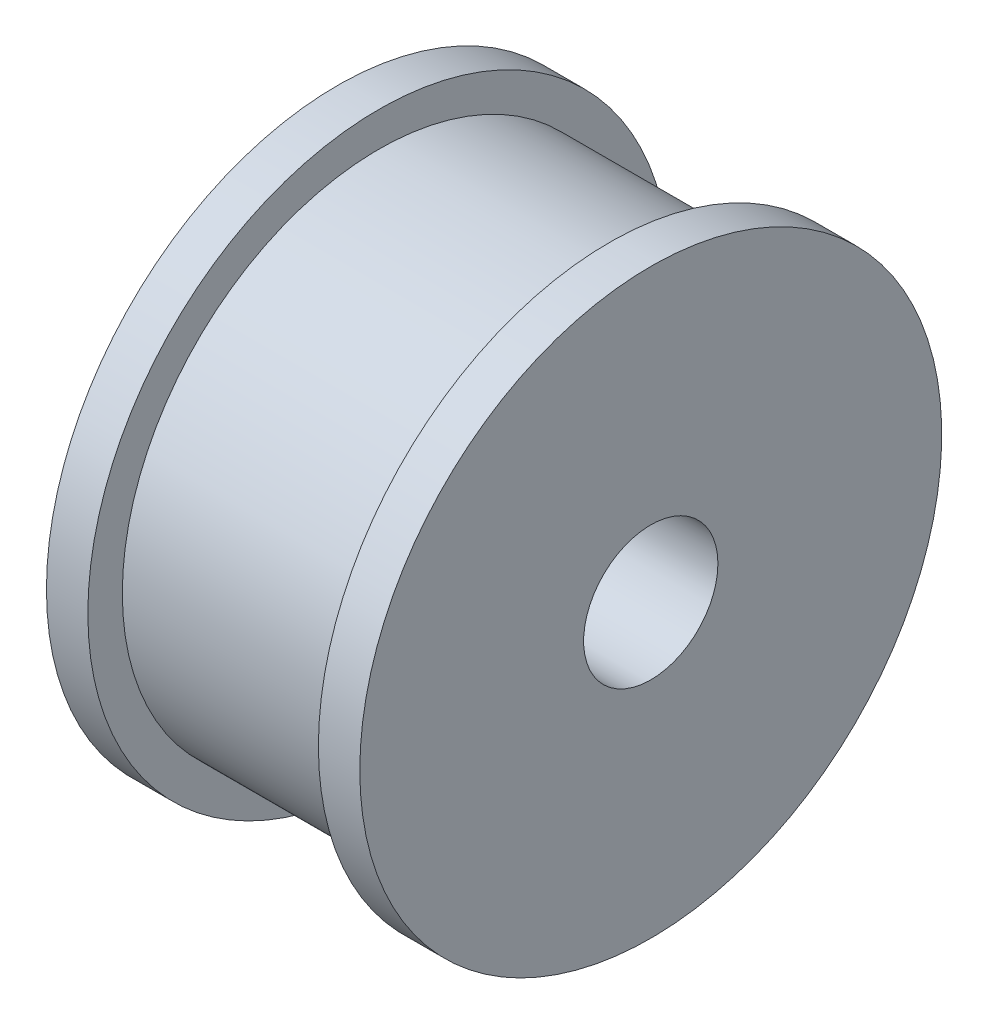
ISO-10303-21;
HEADER;
FILE_DESCRIPTION(('STEP AP214'),'2;1');
FILE_NAME('part.step','',(''),(''),'','','');
FILE_SCHEMA(('AUTOMOTIVE_DESIGN { 1 0 10303 214 1 1 1 1 }'));
ENDSEC;
DATA;
#1=APPLICATION_CONTEXT('core data for automotive mechanical design processes');
#2=APPLICATION_PROTOCOL_DEFINITION('international standard','automotive_design',2000,#1);
#3=PRODUCT_CONTEXT('',#1,'mechanical');
#4=PRODUCT('Part','Part','',(#3));
#5=PRODUCT_RELATED_PRODUCT_CATEGORY('part','',(#4));
#6=PRODUCT_DEFINITION_FORMATION('','',#4);
#7=PRODUCT_DEFINITION_CONTEXT('part definition',#1,'design');
#8=PRODUCT_DEFINITION('design','',#6,#7);
#9=PRODUCT_DEFINITION_SHAPE('','',#8);
#10=(LENGTH_UNIT() NAMED_UNIT(*) SI_UNIT(.MILLI.,.METRE.));
#11=(NAMED_UNIT(*) PLANE_ANGLE_UNIT() SI_UNIT($,.RADIAN.));
#12=(NAMED_UNIT(*) SI_UNIT($,.STERADIAN.) SOLID_ANGLE_UNIT());
#13=UNCERTAINTY_MEASURE_WITH_UNIT(LENGTH_MEASURE(1.E-05),#10,'distance_accuracy_value','');
#14=(GEOMETRIC_REPRESENTATION_CONTEXT(3) GLOBAL_UNCERTAINTY_ASSIGNED_CONTEXT((#13)) GLOBAL_UNIT_ASSIGNED_CONTEXT((#10,
#11,#12)) REPRESENTATION_CONTEXT('',''));
#15=CARTESIAN_POINT('',(0.,0.,0.));
#16=DIRECTION('',(0.,0.,1.));
#17=DIRECTION('',(1.,0.,0.));
#18=AXIS2_PLACEMENT_3D('',#15,#16,#17);
#19=CARTESIAN_POINT('',(-5.15,0.,11.46));
#20=DIRECTION('',(1.,0.,0.));
#21=DIRECTION('',(0.,0.,-1.));
#22=AXIS2_PLACEMENT_3D('',#19,#20,#21);
#23=PLANE('',#22);
#24=CARTESIAN_POINT('',(-5.15,0.,0.));
#25=DIRECTION('',(-1.,0.,0.));
#26=DIRECTION('',(0.,0.,1.));
#27=AXIS2_PLACEMENT_3D('',#24,#25,#26);
#28=CIRCLE('',#27,11.46);
#29=CARTESIAN_POINT('',(-5.15,0.,11.46));
#30=VERTEX_POINT('',#29);
#31=EDGE_CURVE('E53',#30,#30,#28,.T.);
#32=ORIENTED_EDGE('',*,*,#31,.T.);
#33=EDGE_LOOP('',(#32));
#34=FACE_BOUND('',#33,.T.);
#35=CARTESIAN_POINT('',(-5.15,0.,0.));
#36=DIRECTION('',(-1.,0.,0.));
#37=DIRECTION('',(0.,0.,1.));
#38=AXIS2_PLACEMENT_3D('',#35,#36,#37);
#39=CIRCLE('',#38,13.);
#40=CARTESIAN_POINT('',(-5.15,0.,13.));
#41=VERTEX_POINT('',#40);
#42=EDGE_CURVE('E10',#41,#41,#39,.T.);
#43=ORIENTED_EDGE('',*,*,#42,.F.);
#44=EDGE_LOOP('',(#43));
#45=FACE_BOUND('',#44,.T.);
#46=ADVANCED_FACE('F31',(#34,#45),#23,.T.);
#47=CARTESIAN_POINT('',(-7.,0.,0.));
#48=DIRECTION('',(-1.,0.,0.));
#49=DIRECTION('',(0.,0.,1.));
#50=AXIS2_PLACEMENT_3D('',#47,#48,#49);
#51=CYLINDRICAL_SURFACE('',#50,13.);
#52=ORIENTED_EDGE('',*,*,#42,.T.);
#53=EDGE_LOOP('',(#52));
#54=FACE_BOUND('',#53,.T.);
#55=CARTESIAN_POINT('',(-7.,0.,0.));
#56=DIRECTION('',(-1.,0.,0.));
#57=DIRECTION('',(0.,0.,1.));
#58=AXIS2_PLACEMENT_3D('',#55,#56,#57);
#59=CIRCLE('',#58,13.);
#60=CARTESIAN_POINT('',(-7.,0.,13.));
#61=VERTEX_POINT('',#60);
#62=EDGE_CURVE('E37',#61,#61,#59,.T.);
#63=ORIENTED_EDGE('',*,*,#62,.F.);
#64=EDGE_LOOP('',(#63));
#65=FACE_BOUND('',#64,.T.);
#66=ADVANCED_FACE('F92',(#54,#65),#51,.T.);
#67=CARTESIAN_POINT('',(-7.,0.,13.));
#68=DIRECTION('',(-1.,0.,0.));
#69=DIRECTION('',(0.,0.,1.));
#70=AXIS2_PLACEMENT_3D('',#67,#68,#69);
#71=PLANE('',#70);
#72=CARTESIAN_POINT('',(-7.,0.,0.));
#73=DIRECTION('',(-1.,0.,0.));
#74=DIRECTION('',(0.,0.,1.));
#75=AXIS2_PLACEMENT_3D('',#72,#73,#74);
#76=CIRCLE('',#75,2.99999999999999);
#77=CARTESIAN_POINT('',(-7.,0.,2.99999999999999));
#78=VERTEX_POINT('',#77);
#79=EDGE_CURVE('E56',#78,#78,#76,.T.);
#80=ORIENTED_EDGE('',*,*,#79,.F.);
#81=EDGE_LOOP('',(#80));
#82=FACE_BOUND('',#81,.T.);
#83=ORIENTED_EDGE('',*,*,#62,.T.);
#84=EDGE_LOOP('',(#83));
#85=FACE_BOUND('',#84,.T.);
#86=ADVANCED_FACE('F69',(#82,#85),#71,.T.);
#87=CARTESIAN_POINT('',(7.,0.,0.));
#88=DIRECTION('',(1.,0.,0.));
#89=DIRECTION('',(0.,0.,-1.));
#90=AXIS2_PLACEMENT_3D('',#87,#88,#89);
#91=PLANE('',#90);
#92=CARTESIAN_POINT('',(7.,0.,0.));
#93=DIRECTION('',(1.,0.,0.));
#94=DIRECTION('',(0.,0.,-1.));
#95=AXIS2_PLACEMENT_3D('',#92,#93,#94);
#96=CIRCLE('',#95,2.99999999999999);
#97=CARTESIAN_POINT('',(7.,0.,-2.99999999999999));
#98=VERTEX_POINT('',#97);
#99=EDGE_CURVE('E59',#98,#98,#96,.T.);
#100=ORIENTED_EDGE('',*,*,#99,.F.);
#101=EDGE_LOOP('',(#100));
#102=FACE_BOUND('',#101,.T.);
#103=CARTESIAN_POINT('',(7.,0.,0.));
#104=DIRECTION('',(-1.,0.,0.));
#105=DIRECTION('',(0.,0.,1.));
#106=AXIS2_PLACEMENT_3D('',#103,#104,#105);
#107=CIRCLE('',#106,13.);
#108=CARTESIAN_POINT('',(7.,0.,13.));
#109=VERTEX_POINT('',#108);
#110=EDGE_CURVE('E41',#109,#109,#107,.T.);
#111=ORIENTED_EDGE('',*,*,#110,.F.);
#112=EDGE_LOOP('',(#111));
#113=FACE_BOUND('',#112,.T.);
#114=ADVANCED_FACE('F65',(#102,#113),#91,.T.);
#115=CARTESIAN_POINT('',(-7.,0.,0.));
#116=DIRECTION('',(-1.,0.,0.));
#117=DIRECTION('',(0.,0.,1.));
#118=AXIS2_PLACEMENT_3D('',#115,#116,#117);
#119=CYLINDRICAL_SURFACE('',#118,13.);
#120=ORIENTED_EDGE('',*,*,#110,.T.);
#121=EDGE_LOOP('',(#120));
#122=FACE_BOUND('',#121,.T.);
#123=CARTESIAN_POINT('',(5.15,0.,0.));
#124=DIRECTION('',(-1.,0.,0.));
#125=DIRECTION('',(0.,0.,1.));
#126=AXIS2_PLACEMENT_3D('',#123,#124,#125);
#127=CIRCLE('',#126,13.);
#128=CARTESIAN_POINT('',(5.15,0.,13.));
#129=VERTEX_POINT('',#128);
#130=EDGE_CURVE('E45',#129,#129,#127,.T.);
#131=ORIENTED_EDGE('',*,*,#130,.F.);
#132=EDGE_LOOP('',(#131));
#133=FACE_BOUND('',#132,.T.);
#134=ADVANCED_FACE('F68',(#122,#133),#119,.T.);
#135=CARTESIAN_POINT('',(5.15000000000001,0.,13.));
#136=DIRECTION('',(-1.,0.,0.));
#137=DIRECTION('',(0.,0.,1.));
#138=AXIS2_PLACEMENT_3D('',#135,#136,#137);
#139=PLANE('',#138);
#140=ORIENTED_EDGE('',*,*,#130,.T.);
#141=EDGE_LOOP('',(#140));
#142=FACE_BOUND('',#141,.T.);
#143=CARTESIAN_POINT('',(5.15000000000001,0.,0.));
#144=DIRECTION('',(-1.,0.,0.));
#145=DIRECTION('',(0.,0.,1.));
#146=AXIS2_PLACEMENT_3D('',#143,#144,#145);
#147=CIRCLE('',#146,11.46);
#148=CARTESIAN_POINT('',(5.15000000000001,0.,11.46));
#149=VERTEX_POINT('',#148);
#150=EDGE_CURVE('E50',#149,#149,#147,.T.);
#151=ORIENTED_EDGE('',*,*,#150,.F.);
#152=EDGE_LOOP('',(#151));
#153=FACE_BOUND('',#152,.T.);
#154=ADVANCED_FACE('F75',(#142,#153),#139,.T.);
#155=CARTESIAN_POINT('',(-7.,0.,0.));
#156=DIRECTION('',(-1.,0.,0.));
#157=DIRECTION('',(0.,0.,1.));
#158=AXIS2_PLACEMENT_3D('',#155,#156,#157);
#159=CYLINDRICAL_SURFACE('',#158,11.46);
#160=ORIENTED_EDGE('',*,*,#150,.T.);
#161=EDGE_LOOP('',(#160));
#162=FACE_BOUND('',#161,.T.);
#163=ORIENTED_EDGE('',*,*,#31,.F.);
#164=EDGE_LOOP('',(#163));
#165=FACE_BOUND('',#164,.T.);
#166=ADVANCED_FACE('F81',(#162,#165),#159,.T.);
#167=CARTESIAN_POINT('',(7.,0.,0.));
#168=DIRECTION('',(1.,0.,0.));
#169=DIRECTION('',(0.,0.,-1.));
#170=AXIS2_PLACEMENT_3D('',#167,#168,#169);
#171=CYLINDRICAL_SURFACE('',#170,2.99999999999999);
#172=ORIENTED_EDGE('',*,*,#79,.T.);
#173=EDGE_LOOP('',(#172));
#174=FACE_BOUND('',#173,.T.);
#175=ORIENTED_EDGE('',*,*,#99,.T.);
#176=EDGE_LOOP('',(#175));
#177=FACE_BOUND('',#176,.T.);
#178=ADVANCED_FACE('F63',(#174,#177),#171,.F.);
#179=CLOSED_SHELL('',(#46,#66,#86,#114,#134,#154,#166,#178));
#180=MANIFOLD_SOLID_BREP('B2',#179);
#181=ADVANCED_BREP_SHAPE_REPRESENTATION('',(#18,#180),#14);
#182=SHAPE_DEFINITION_REPRESENTATION(#9,#181);
ENDSEC;
END-ISO-10303-21;
